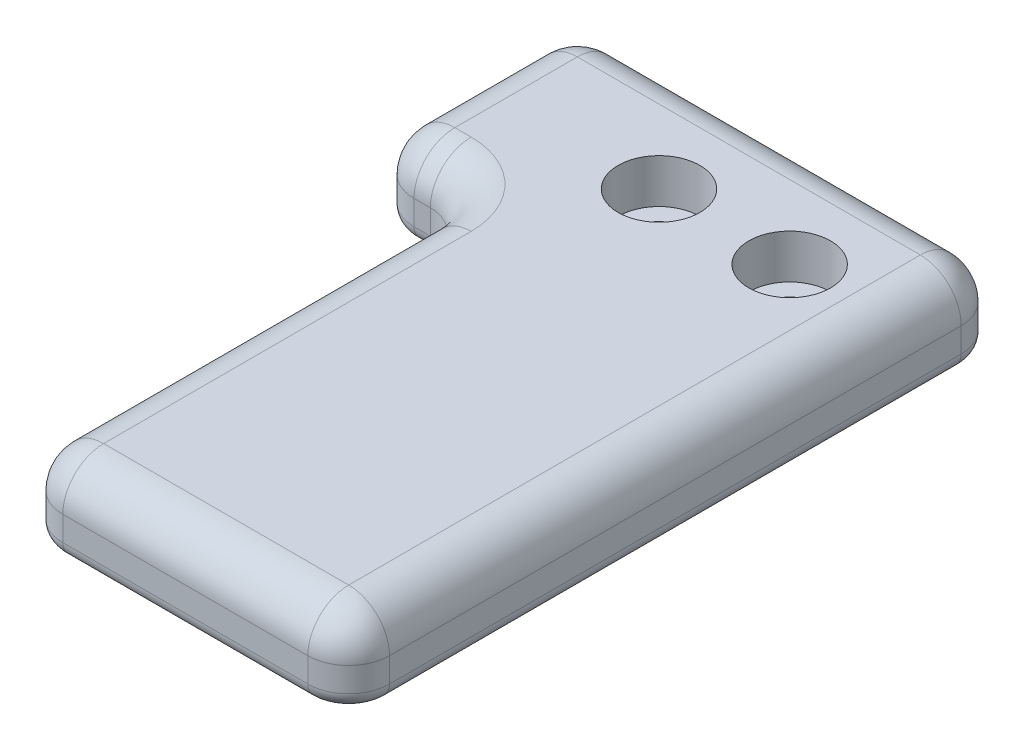
ISO-10303-21;
HEADER;
FILE_DESCRIPTION(('STEP AP214'),'2;1');
FILE_NAME('part.step','',(''),(''),'','','');
FILE_SCHEMA(('AUTOMOTIVE_DESIGN { 1 0 10303 214 1 1 1 1 }'));
ENDSEC;
DATA;
#1=APPLICATION_CONTEXT('core data for automotive mechanical design processes');
#2=APPLICATION_PROTOCOL_DEFINITION('international standard','automotive_design',2000,#1);
#3=PRODUCT_CONTEXT('',#1,'mechanical');
#4=PRODUCT('Part','Part','',(#3));
#5=PRODUCT_RELATED_PRODUCT_CATEGORY('part','',(#4));
#6=PRODUCT_DEFINITION_FORMATION('','',#4);
#7=PRODUCT_DEFINITION_CONTEXT('part definition',#1,'design');
#8=PRODUCT_DEFINITION('design','',#6,#7);
#9=PRODUCT_DEFINITION_SHAPE('','',#8);
#10=(LENGTH_UNIT() NAMED_UNIT(*) SI_UNIT(.MILLI.,.METRE.));
#11=(NAMED_UNIT(*) PLANE_ANGLE_UNIT() SI_UNIT($,.RADIAN.));
#12=(NAMED_UNIT(*) SI_UNIT($,.STERADIAN.) SOLID_ANGLE_UNIT());
#13=UNCERTAINTY_MEASURE_WITH_UNIT(LENGTH_MEASURE(1.E-05),#10,'distance_accuracy_value','');
#14=(GEOMETRIC_REPRESENTATION_CONTEXT(3) GLOBAL_UNCERTAINTY_ASSIGNED_CONTEXT((#13)) GLOBAL_UNIT_ASSIGNED_CONTEXT((#10,
#11,#12)) REPRESENTATION_CONTEXT('',''));
#15=CARTESIAN_POINT('',(0.,0.,0.));
#16=DIRECTION('',(0.,0.,1.));
#17=DIRECTION('',(1.,0.,0.));
#18=AXIS2_PLACEMENT_3D('',#15,#16,#17);
#19=CARTESIAN_POINT('',(15.7975674601214,10.,0.));
#20=DIRECTION('',(-1.,0.,0.));
#21=DIRECTION('',(0.,0.,1.));
#22=AXIS2_PLACEMENT_3D('',#19,#20,#21);
#23=PLANE('',#22);
#24=DIRECTION('',(0.,-1.,0.));
#25=VECTOR('',#24,1.);
#26=CARTESIAN_POINT('',(15.7975674601214,10.,-67.0000000000004));
#27=LINE('',#26,#25);
#28=CARTESIAN_POINT('',(15.7975674601214,5.,-67.0000000000004));
#29=VERTEX_POINT('',#28);
#30=CARTESIAN_POINT('',(15.7975674601214,2.,-67.0000000000004));
#31=VERTEX_POINT('',#30);
#32=EDGE_CURVE('E401',#29,#31,#27,.T.);
#33=ORIENTED_EDGE('',*,*,#32,.T.);
#34=DIRECTION('',(0.,0.,-1.));
#35=VECTOR('',#34,1.);
#36=CARTESIAN_POINT('',(15.7975674601214,2.,-52.0000000000003));
#37=LINE('',#36,#35);
#38=CARTESIAN_POINT('',(15.7975674601214,2.,-52.0000000000003));
#39=VERTEX_POINT('',#38);
#40=EDGE_CURVE('E326',#31,#39,#37,.F.);
#41=ORIENTED_EDGE('',*,*,#40,.T.);
#42=DIRECTION('',(0.,-1.,0.));
#43=VECTOR('',#42,1.);
#44=CARTESIAN_POINT('',(15.7975674601214,10.,-52.0000000000003));
#45=LINE('',#44,#43);
#46=CARTESIAN_POINT('',(15.7975674601214,5.,-52.0000000000003));
#47=VERTEX_POINT('',#46);
#48=EDGE_CURVE('E192',#39,#47,#45,.F.);
#49=ORIENTED_EDGE('',*,*,#48,.T.);
#50=DIRECTION('',(0.,0.,-1.));
#51=VECTOR('',#50,1.);
#52=CARTESIAN_POINT('',(15.7975674601214,5.,0.));
#53=LINE('',#52,#51);
#54=EDGE_CURVE('E229',#47,#29,#53,.T.);
#55=ORIENTED_EDGE('',*,*,#54,.T.);
#56=EDGE_LOOP('',(#33,#41,#49,#55));
#57=FACE_BOUND('',#56,.T.);
#58=ADVANCED_FACE('F39',(#57),#23,.T.);
#59=CARTESIAN_POINT('',(3.26128013483643E-13,10.,-47.0000000000005));
#60=DIRECTION('',(0.,0.,1.));
#61=DIRECTION('',(1.,0.,0.));
#62=AXIS2_PLACEMENT_3D('',#59,#60,#61);
#63=PLANE('',#62);
#64=DIRECTION('',(0.,-1.,0.));
#65=VECTOR('',#64,1.);
#66=CARTESIAN_POINT('',(20.7975674601214,10.,-47.0000000000003));
#67=LINE('',#66,#65);
#68=CARTESIAN_POINT('',(20.7975674601214,5.,-47.0000000000003));
#69=VERTEX_POINT('',#68);
#70=CARTESIAN_POINT('',(20.7975674601214,2.,-47.0000000000003));
#71=VERTEX_POINT('',#70);
#72=EDGE_CURVE('E223',#69,#71,#67,.T.);
#73=ORIENTED_EDGE('',*,*,#72,.T.);
#74=DIRECTION('',(-1.,0.,0.));
#75=VECTOR('',#74,1.);
#76=CARTESIAN_POINT('',(22.7975674601214,2.,-47.0000000000003));
#77=LINE('',#76,#75);
#78=CARTESIAN_POINT('',(22.7975674601214,2.,-47.0000000000003));
#79=VERTEX_POINT('',#78);
#80=EDGE_CURVE('E330',#71,#79,#77,.F.);
#81=ORIENTED_EDGE('',*,*,#80,.T.);
#82=DIRECTION('',(0.,-1.,0.));
#83=VECTOR('',#82,1.);
#84=CARTESIAN_POINT('',(22.7975674601214,10.,-47.0000000000003));
#85=LINE('',#84,#83);
#86=CARTESIAN_POINT('',(22.7975674601214,5.,-47.0000000000003));
#87=VERTEX_POINT('',#86);
#88=EDGE_CURVE('E218',#79,#87,#85,.F.);
#89=ORIENTED_EDGE('',*,*,#88,.T.);
#90=DIRECTION('',(-1.,0.,0.));
#91=VECTOR('',#90,1.);
#92=CARTESIAN_POINT('',(3.26128013483643E-13,5.,-47.0000000000005));
#93=LINE('',#92,#91);
#94=EDGE_CURVE('E249',#87,#69,#93,.T.);
#95=ORIENTED_EDGE('',*,*,#94,.T.);
#96=EDGE_LOOP('',(#73,#81,#89,#95));
#97=FACE_BOUND('',#96,.T.);
#98=ADVANCED_FACE('F387',(#97),#63,.T.);
#99=CARTESIAN_POINT('',(27.7975674601214,10.,0.));
#100=DIRECTION('',(-1.,0.,0.));
#101=DIRECTION('',(0.,0.,1.));
#102=AXIS2_PLACEMENT_3D('',#99,#100,#101);
#103=PLANE('',#102);
#104=DIRECTION('',(0.,-1.,0.));
#105=VECTOR('',#104,1.);
#106=CARTESIAN_POINT('',(27.7975674601214,0.,-42.0000000000003));
#107=LINE('',#106,#105);
#108=CARTESIAN_POINT('',(27.7975674601214,5.,-42.0000000000003));
#109=VERTEX_POINT('',#108);
#110=CARTESIAN_POINT('',(27.7975674601214,2.,-42.0000000000003));
#111=VERTEX_POINT('',#110);
#112=EDGE_CURVE('E193',#109,#111,#107,.T.);
#113=ORIENTED_EDGE('',*,*,#112,.T.);
#114=DIRECTION('',(0.,0.,-1.));
#115=VECTOR('',#114,1.);
#116=CARTESIAN_POINT('',(27.7975674601214,2.,2.99999999999973));
#117=LINE('',#116,#115);
#118=CARTESIAN_POINT('',(27.7975674601214,2.,2.99999999999973));
#119=VERTEX_POINT('',#118);
#120=EDGE_CURVE('E63',#111,#119,#117,.F.);
#121=ORIENTED_EDGE('',*,*,#120,.T.);
#122=DIRECTION('',(0.,-1.,0.));
#123=VECTOR('',#122,1.);
#124=CARTESIAN_POINT('',(27.7975674601214,10.,2.99999999999973));
#125=LINE('',#124,#123);
#126=CARTESIAN_POINT('',(27.7975674601214,5.,2.99999999999973));
#127=VERTEX_POINT('',#126);
#128=EDGE_CURVE('E184',#119,#127,#125,.F.);
#129=ORIENTED_EDGE('',*,*,#128,.T.);
#130=DIRECTION('',(0.,0.,-1.));
#131=VECTOR('',#130,1.);
#132=CARTESIAN_POINT('',(27.7975674601214,5.,0.));
#133=LINE('',#132,#131);
#134=EDGE_CURVE('E188',#127,#109,#133,.T.);
#135=ORIENTED_EDGE('',*,*,#134,.T.);
#136=EDGE_LOOP('',(#113,#121,#129,#135));
#137=FACE_BOUND('',#136,.T.);
#138=ADVANCED_FACE('F186',(#137),#103,.T.);
#139=CARTESIAN_POINT('',(0.,10.,7.99999999999973));
#140=DIRECTION('',(0.,0.,-1.));
#141=DIRECTION('',(-1.,0.,0.));
#142=AXIS2_PLACEMENT_3D('',#139,#140,#141);
#143=PLANE('',#142);
#144=DIRECTION('',(0.,-1.,0.));
#145=VECTOR('',#144,1.);
#146=CARTESIAN_POINT('',(32.7975674601214,0.,7.99999999999973));
#147=LINE('',#146,#145);
#148=CARTESIAN_POINT('',(32.7975674601214,5.,7.99999999999973));
#149=VERTEX_POINT('',#148);
#150=CARTESIAN_POINT('',(32.7975674601214,2.,7.99999999999973));
#151=VERTEX_POINT('',#150);
#152=EDGE_CURVE('E216',#149,#151,#147,.T.);
#153=ORIENTED_EDGE('',*,*,#152,.T.);
#154=DIRECTION('',(1.,0.,0.));
#155=VECTOR('',#154,1.);
#156=CARTESIAN_POINT('',(0.,2.,7.99999999999973));
#157=LINE('',#156,#155);
#158=CARTESIAN_POINT('',(62.7975674601214,2.,7.99999999999973));
#159=VERTEX_POINT('',#158);
#160=EDGE_CURVE('E11',#151,#159,#157,.T.);
#161=ORIENTED_EDGE('',*,*,#160,.T.);
#162=DIRECTION('',(0.,-1.,0.));
#163=VECTOR('',#162,1.);
#164=CARTESIAN_POINT('',(62.7975674601214,10.,7.99999999999973));
#165=LINE('',#164,#163);
#166=CARTESIAN_POINT('',(62.7975674601214,5.,7.99999999999973));
#167=VERTEX_POINT('',#166);
#168=EDGE_CURVE('E290',#159,#167,#165,.F.);
#169=ORIENTED_EDGE('',*,*,#168,.T.);
#170=DIRECTION('',(1.,0.,0.));
#171=VECTOR('',#170,1.);
#172=CARTESIAN_POINT('',(32.7975674601214,5.,7.99999999999973));
#173=LINE('',#172,#171);
#174=EDGE_CURVE('E213',#167,#149,#173,.F.);
#175=ORIENTED_EDGE('',*,*,#174,.T.);
#176=EDGE_LOOP('',(#153,#161,#169,#175));
#177=FACE_BOUND('',#176,.T.);
#178=ADVANCED_FACE('F491',(#177),#143,.F.);
#179=CARTESIAN_POINT('',(67.7975674601214,10.,0.));
#180=DIRECTION('',(-1.,0.,0.));
#181=DIRECTION('',(0.,0.,1.));
#182=AXIS2_PLACEMENT_3D('',#179,#180,#181);
#183=PLANE('',#182);
#184=DIRECTION('',(0.,-1.,0.));
#185=VECTOR('',#184,1.);
#186=CARTESIAN_POINT('',(67.7975674601214,10.,2.99999999999973));
#187=LINE('',#186,#185);
#188=CARTESIAN_POINT('',(67.7975674601214,5.,2.99999999999973));
#189=VERTEX_POINT('',#188);
#190=CARTESIAN_POINT('',(67.7975674601214,2.,2.99999999999973));
#191=VERTEX_POINT('',#190);
#192=EDGE_CURVE('E391',#189,#191,#187,.T.);
#193=ORIENTED_EDGE('',*,*,#192,.T.);
#194=DIRECTION('',(0.,0.,-1.));
#195=VECTOR('',#194,1.);
#196=CARTESIAN_POINT('',(67.7975674601214,2.,0.));
#197=LINE('',#196,#195);
#198=CARTESIAN_POINT('',(67.7975674601214,2.,-67.0000000000003));
#199=VERTEX_POINT('',#198);
#200=EDGE_CURVE('E318',#191,#199,#197,.T.);
#201=ORIENTED_EDGE('',*,*,#200,.T.);
#202=DIRECTION('',(0.,-1.,0.));
#203=VECTOR('',#202,1.);
#204=CARTESIAN_POINT('',(67.7975674601214,10.,-67.0000000000003));
#205=LINE('',#204,#203);
#206=CARTESIAN_POINT('',(67.7975674601214,5.,-67.0000000000003));
#207=VERTEX_POINT('',#206);
#208=EDGE_CURVE('E390',#199,#207,#205,.F.);
#209=ORIENTED_EDGE('',*,*,#208,.T.);
#210=DIRECTION('',(0.,0.,-1.));
#211=VECTOR('',#210,1.);
#212=CARTESIAN_POINT('',(67.7975674601214,5.,2.99999999999973));
#213=LINE('',#212,#211);
#214=EDGE_CURVE('E256',#207,#189,#213,.F.);
#215=ORIENTED_EDGE('',*,*,#214,.T.);
#216=EDGE_LOOP('',(#193,#201,#209,#215));
#217=FACE_BOUND('',#216,.T.);
#218=ADVANCED_FACE('F509',(#217),#183,.F.);
#219=CARTESIAN_POINT('',(1.15292391018767E-13,10.,-72.0000000000004));
#220=DIRECTION('',(0.,0.,-1.));
#221=DIRECTION('',(-1.,0.,0.));
#222=AXIS2_PLACEMENT_3D('',#219,#220,#221);
#223=PLANE('',#222);
#224=DIRECTION('',(0.,-1.,0.));
#225=VECTOR('',#224,1.);
#226=CARTESIAN_POINT('',(62.7975674601214,0.,-72.0000000000003));
#227=LINE('',#226,#225);
#228=CARTESIAN_POINT('',(62.7975674601214,5.,-72.0000000000003));
#229=VERTEX_POINT('',#228);
#230=CARTESIAN_POINT('',(62.7975674601214,2.,-72.0000000000003));
#231=VERTEX_POINT('',#230);
#232=EDGE_CURVE('E398',#229,#231,#227,.T.);
#233=ORIENTED_EDGE('',*,*,#232,.T.);
#234=DIRECTION('',(1.,0.,0.));
#235=VECTOR('',#234,1.);
#236=CARTESIAN_POINT('',(20.7975674601214,2.,-72.0000000000004));
#237=LINE('',#236,#235);
#238=CARTESIAN_POINT('',(20.7975674601214,2.,-72.0000000000004));
#239=VERTEX_POINT('',#238);
#240=EDGE_CURVE('E322',#231,#239,#237,.F.);
#241=ORIENTED_EDGE('',*,*,#240,.T.);
#242=DIRECTION('',(0.,-1.,0.));
#243=VECTOR('',#242,1.);
#244=CARTESIAN_POINT('',(20.7975674601214,10.,-72.0000000000004));
#245=LINE('',#244,#243);
#246=CARTESIAN_POINT('',(20.7975674601214,5.,-72.0000000000004));
#247=VERTEX_POINT('',#246);
#248=EDGE_CURVE('E396',#239,#247,#245,.F.);
#249=ORIENTED_EDGE('',*,*,#248,.T.);
#250=DIRECTION('',(1.,0.,0.));
#251=VECTOR('',#250,1.);
#252=CARTESIAN_POINT('',(1.15292391018767E-13,5.,-72.0000000000004));
#253=LINE('',#252,#251);
#254=EDGE_CURVE('E254',#247,#229,#253,.T.);
#255=ORIENTED_EDGE('',*,*,#254,.T.);
#256=EDGE_LOOP('',(#233,#241,#249,#255));
#257=FACE_BOUND('',#256,.T.);
#258=ADVANCED_FACE('F438',(#257),#223,.T.);
#259=CARTESIAN_POINT('',(0.,10.,0.));
#260=DIRECTION('',(0.,1.,0.));
#261=DIRECTION('',(0.,0.,1.));
#262=AXIS2_PLACEMENT_3D('',#259,#260,#261);
#263=PLANE('',#262);
#264=CARTESIAN_POINT('',(55.7975674601214,10.,-58.0000000000002));
#265=DIRECTION('',(0.,1.,0.));
#266=DIRECTION('',(0.,0.,1.));
#267=AXIS2_PLACEMENT_3D('',#264,#265,#266);
#268=CIRCLE('',#267,5.);
#269=CARTESIAN_POINT('',(55.7975674601214,10.,-53.0000000000002));
#270=VERTEX_POINT('',#269);
#271=EDGE_CURVE('E428',#270,#270,#268,.T.);
#272=ORIENTED_EDGE('',*,*,#271,.F.);
#273=EDGE_LOOP('',(#272));
#274=FACE_BOUND('',#273,.T.);
#275=CARTESIAN_POINT('',(39.7975674601214,10.,-58.0000000000003));
#276=DIRECTION('',(0.,1.,0.));
#277=DIRECTION('',(0.,0.,1.));
#278=AXIS2_PLACEMENT_3D('',#275,#276,#277);
#279=CIRCLE('',#278,5.);
#280=CARTESIAN_POINT('',(39.7975674601214,10.,-53.0000000000003));
#281=VERTEX_POINT('',#280);
#282=EDGE_CURVE('E416',#281,#281,#279,.T.);
#283=ORIENTED_EDGE('',*,*,#282,.F.);
#284=EDGE_LOOP('',(#283));
#285=FACE_BOUND('',#284,.T.);
#286=DIRECTION('',(1.,0.,0.));
#287=VECTOR('',#286,1.);
#288=CARTESIAN_POINT('',(1.07285974975797E-13,10.,-67.0000000000004));
#289=LINE('',#288,#287);
#290=CARTESIAN_POINT('',(62.7975674601214,10.,-67.0000000000003));
#291=VERTEX_POINT('',#290);
#292=CARTESIAN_POINT('',(20.7975674601214,10.,-67.0000000000004));
#293=VERTEX_POINT('',#292);
#294=EDGE_CURVE('E237',#291,#293,#289,.F.);
#295=ORIENTED_EDGE('',*,*,#294,.T.);
#296=DIRECTION('',(0.,0.,-1.));
#297=VECTOR('',#296,1.);
#298=CARTESIAN_POINT('',(20.7975674601214,10.,0.));
#299=LINE('',#298,#297);
#300=CARTESIAN_POINT('',(20.7975674601214,10.,-52.0000000000003));
#301=VERTEX_POINT('',#300);
#302=EDGE_CURVE('E243',#293,#301,#299,.F.);
#303=ORIENTED_EDGE('',*,*,#302,.T.);
#304=DIRECTION('',(-1.,0.,0.));
#305=VECTOR('',#304,1.);
#306=CARTESIAN_POINT('',(3.60822483003179E-13,10.,-52.0000000000005));
#307=LINE('',#306,#305);
#308=CARTESIAN_POINT('',(22.7975674601215,10.,-52.0000000000003));
#309=VERTEX_POINT('',#308);
#310=EDGE_CURVE('E241',#301,#309,#307,.F.);
#311=ORIENTED_EDGE('',*,*,#310,.T.);
#312=CARTESIAN_POINT('',(22.7975674601214,10.,-42.0000000000003));
#313=DIRECTION('',(0.,1.,0.));
#314=DIRECTION('',(0.,0.,1.));
#315=AXIS2_PLACEMENT_3D('',#312,#313,#314);
#316=CIRCLE('',#315,10.);
#317=CARTESIAN_POINT('',(32.7975674601214,10.,-42.0000000000003));
#318=VERTEX_POINT('',#317);
#319=EDGE_CURVE('E239',#309,#318,#316,.F.);
#320=ORIENTED_EDGE('',*,*,#319,.T.);
#321=DIRECTION('',(0.,0.,-1.));
#322=VECTOR('',#321,1.);
#323=CARTESIAN_POINT('',(32.7975674601214,10.,0.));
#324=LINE('',#323,#322);
#325=CARTESIAN_POINT('',(32.7975674601214,10.,2.99999999999973));
#326=VERTEX_POINT('',#325);
#327=EDGE_CURVE('E231',#318,#326,#324,.F.);
#328=ORIENTED_EDGE('',*,*,#327,.T.);
#329=DIRECTION('',(1.,0.,0.));
#330=VECTOR('',#329,1.);
#331=CARTESIAN_POINT('',(62.7975674601214,10.,2.99999999999973));
#332=LINE('',#331,#330);
#333=CARTESIAN_POINT('',(62.7975674601214,10.,2.99999999999973));
#334=VERTEX_POINT('',#333);
#335=EDGE_CURVE('E233',#326,#334,#332,.T.);
#336=ORIENTED_EDGE('',*,*,#335,.T.);
#337=DIRECTION('',(0.,0.,-1.));
#338=VECTOR('',#337,1.);
#339=CARTESIAN_POINT('',(62.7975674601214,10.,-67.0000000000003));
#340=LINE('',#339,#338);
#341=EDGE_CURVE('E235',#334,#291,#340,.T.);
#342=ORIENTED_EDGE('',*,*,#341,.T.);
#343=EDGE_LOOP('',(#295,#303,#311,#320,#328,#336,#342));
#344=FACE_BOUND('',#343,.T.);
#345=ADVANCED_FACE('F434',(#274,#285,#344),#263,.T.);
#346=CARTESIAN_POINT('',(0.,0.,0.));
#347=DIRECTION('',(0.,1.,0.));
#348=DIRECTION('',(0.,0.,1.));
#349=AXIS2_PLACEMENT_3D('',#346,#347,#348);
#350=PLANE('',#349);
#351=CARTESIAN_POINT('',(55.7975674601214,0.,-58.0000000000002));
#352=DIRECTION('',(0.,1.,0.));
#353=DIRECTION('',(0.,0.,1.));
#354=AXIS2_PLACEMENT_3D('',#351,#352,#353);
#355=CIRCLE('',#354,2.75);
#356=CARTESIAN_POINT('',(55.7975674601214,0.,-55.2500000000002));
#357=VERTEX_POINT('',#356);
#358=EDGE_CURVE('E419',#357,#357,#355,.T.);
#359=ORIENTED_EDGE('',*,*,#358,.T.);
#360=EDGE_LOOP('',(#359));
#361=FACE_BOUND('',#360,.T.);
#362=CARTESIAN_POINT('',(39.7975674601214,0.,-58.0000000000003));
#363=DIRECTION('',(0.,1.,0.));
#364=DIRECTION('',(0.,0.,1.));
#365=AXIS2_PLACEMENT_3D('',#362,#363,#364);
#366=CIRCLE('',#365,2.75);
#367=CARTESIAN_POINT('',(39.7975674601214,0.,-55.2500000000003));
#368=VERTEX_POINT('',#367);
#369=EDGE_CURVE('E339',#368,#368,#366,.T.);
#370=ORIENTED_EDGE('',*,*,#369,.T.);
#371=EDGE_LOOP('',(#370));
#372=FACE_BOUND('',#371,.T.);
#373=DIRECTION('',(0.,0.,-1.));
#374=VECTOR('',#373,1.);
#375=CARTESIAN_POINT('',(65.7975674601214,0.,0.));
#376=LINE('',#375,#374);
#377=CARTESIAN_POINT('',(65.7975674601214,0.,-67.0000000000003));
#378=VERTEX_POINT('',#377);
#379=CARTESIAN_POINT('',(65.7975674601214,0.,2.99999999999973));
#380=VERTEX_POINT('',#379);
#381=EDGE_CURVE('E310',#378,#380,#376,.F.);
#382=ORIENTED_EDGE('',*,*,#381,.T.);
#383=CARTESIAN_POINT('',(62.7975674601214,0.,2.99999999999973));
#384=DIRECTION('',(0.,1.,0.));
#385=DIRECTION('',(0.,0.,1.));
#386=AXIS2_PLACEMENT_3D('',#383,#384,#385);
#387=CIRCLE('',#386,3.);
#388=CARTESIAN_POINT('',(62.7975674601214,0.,5.99999999999973));
#389=VERTEX_POINT('',#388);
#390=EDGE_CURVE('E312',#380,#389,#387,.F.);
#391=ORIENTED_EDGE('',*,*,#390,.T.);
#392=DIRECTION('',(1.,0.,0.));
#393=VECTOR('',#392,1.);
#394=CARTESIAN_POINT('',(0.,0.,5.99999999999973));
#395=LINE('',#394,#393);
#396=CARTESIAN_POINT('',(32.7975674601214,0.,5.99999999999973));
#397=VERTEX_POINT('',#396);
#398=EDGE_CURVE('E212',#389,#397,#395,.F.);
#399=ORIENTED_EDGE('',*,*,#398,.T.);
#400=CARTESIAN_POINT('',(32.7975674601214,0.,2.99999999999973));
#401=DIRECTION('',(0.,1.,0.));
#402=DIRECTION('',(0.,0.,1.));
#403=AXIS2_PLACEMENT_3D('',#400,#401,#402);
#404=CIRCLE('',#403,3.);
#405=CARTESIAN_POINT('',(29.7975674601214,0.,2.99999999999973));
#406=VERTEX_POINT('',#405);
#407=EDGE_CURVE('E292',#397,#406,#404,.F.);
#408=ORIENTED_EDGE('',*,*,#407,.T.);
#409=DIRECTION('',(0.,0.,-1.));
#410=VECTOR('',#409,1.);
#411=CARTESIAN_POINT('',(29.7975674601214,0.,-42.0000000000003));
#412=LINE('',#411,#410);
#413=CARTESIAN_POINT('',(29.7975674601214,0.,-42.0000000000003));
#414=VERTEX_POINT('',#413);
#415=EDGE_CURVE('E294',#406,#414,#412,.T.);
#416=ORIENTED_EDGE('',*,*,#415,.T.);
#417=CARTESIAN_POINT('',(22.7975674601214,0.,-42.0000000000003));
#418=DIRECTION('',(0.,1.,0.));
#419=DIRECTION('',(0.,0.,1.));
#420=AXIS2_PLACEMENT_3D('',#417,#418,#419);
#421=CIRCLE('',#420,7.);
#422=CARTESIAN_POINT('',(22.7975674601214,0.,-49.0000000000003));
#423=VERTEX_POINT('',#422);
#424=EDGE_CURVE('E296',#414,#423,#421,.T.);
#425=ORIENTED_EDGE('',*,*,#424,.T.);
#426=DIRECTION('',(-1.,0.,0.));
#427=VECTOR('',#426,1.);
#428=CARTESIAN_POINT('',(20.7975674601214,0.,-49.0000000000003));
#429=LINE('',#428,#427);
#430=CARTESIAN_POINT('',(20.7975674601214,0.,-49.0000000000003));
#431=VERTEX_POINT('',#430);
#432=EDGE_CURVE('E298',#423,#431,#429,.T.);
#433=ORIENTED_EDGE('',*,*,#432,.T.);
#434=CARTESIAN_POINT('',(20.7975674601214,0.,-52.0000000000003));
#435=DIRECTION('',(0.,1.,0.));
#436=DIRECTION('',(0.,0.,1.));
#437=AXIS2_PLACEMENT_3D('',#434,#435,#436);
#438=CIRCLE('',#437,3.);
#439=CARTESIAN_POINT('',(17.7975674601214,0.,-52.0000000000003));
#440=VERTEX_POINT('',#439);
#441=EDGE_CURVE('E300',#431,#440,#438,.F.);
#442=ORIENTED_EDGE('',*,*,#441,.T.);
#443=DIRECTION('',(0.,0.,-1.));
#444=VECTOR('',#443,1.);
#445=CARTESIAN_POINT('',(17.7975674601214,0.,-67.0000000000004));
#446=LINE('',#445,#444);
#447=CARTESIAN_POINT('',(17.7975674601214,0.,-67.0000000000004));
#448=VERTEX_POINT('',#447);
#449=EDGE_CURVE('E302',#440,#448,#446,.T.);
#450=ORIENTED_EDGE('',*,*,#449,.T.);
#451=CARTESIAN_POINT('',(20.7975674601214,0.,-67.0000000000004));
#452=DIRECTION('',(0.,1.,0.));
#453=DIRECTION('',(0.,0.,1.));
#454=AXIS2_PLACEMENT_3D('',#451,#452,#453);
#455=CIRCLE('',#454,3.);
#456=CARTESIAN_POINT('',(20.7975674601214,0.,-70.0000000000004));
#457=VERTEX_POINT('',#456);
#458=EDGE_CURVE('E304',#448,#457,#455,.F.);
#459=ORIENTED_EDGE('',*,*,#458,.T.);
#460=DIRECTION('',(1.,0.,0.));
#461=VECTOR('',#460,1.);
#462=CARTESIAN_POINT('',(62.7975674601214,0.,-70.0000000000003));
#463=LINE('',#462,#461);
#464=CARTESIAN_POINT('',(62.7975674601214,0.,-70.0000000000003));
#465=VERTEX_POINT('',#464);
#466=EDGE_CURVE('E306',#457,#465,#463,.T.);
#467=ORIENTED_EDGE('',*,*,#466,.T.);
#468=CARTESIAN_POINT('',(62.7975674601214,0.,-67.0000000000003));
#469=DIRECTION('',(0.,1.,0.));
#470=DIRECTION('',(0.,0.,1.));
#471=AXIS2_PLACEMENT_3D('',#468,#469,#470);
#472=CIRCLE('',#471,3.);
#473=EDGE_CURVE('E308',#465,#378,#472,.F.);
#474=ORIENTED_EDGE('',*,*,#473,.T.);
#475=EDGE_LOOP('',(#382,#391,#399,#408,#416,#425,#433,#442,#450,#459,#467,#474));
#476=FACE_BOUND('',#475,.T.);
#477=ADVANCED_FACE('F437',(#361,#372,#476),#350,.F.);
#478=CARTESIAN_POINT('',(32.7975674601214,10.,2.99999999999973));
#479=DIRECTION('',(0.,1.,0.));
#480=DIRECTION('',(0.,0.,1.));
#481=AXIS2_PLACEMENT_3D('',#478,#479,#480);
#482=CYLINDRICAL_SURFACE('',#481,5.);
#483=ORIENTED_EDGE('',*,*,#128,.F.);
#484=CARTESIAN_POINT('',(32.7975674601214,2.,2.99999999999973));
#485=DIRECTION('',(0.,1.,0.));
#486=DIRECTION('',(0.,0.,1.));
#487=AXIS2_PLACEMENT_3D('',#484,#485,#486);
#488=CIRCLE('',#487,5.);
#489=EDGE_CURVE('E48',#119,#151,#488,.T.);
#490=ORIENTED_EDGE('',*,*,#489,.T.);
#491=ORIENTED_EDGE('',*,*,#152,.F.);
#492=CARTESIAN_POINT('',(32.7975674601214,5.,2.99999999999973));
#493=DIRECTION('',(0.,1.,0.));
#494=DIRECTION('',(0.,0.,1.));
#495=AXIS2_PLACEMENT_3D('',#492,#493,#494);
#496=CIRCLE('',#495,5.);
#497=EDGE_CURVE('E201',#149,#127,#496,.F.);
#498=ORIENTED_EDGE('',*,*,#497,.T.);
#499=EDGE_LOOP('',(#483,#490,#491,#498));
#500=FACE_BOUND('',#499,.T.);
#501=ADVANCED_FACE('F215',(#500),#482,.T.);
#502=CARTESIAN_POINT('',(20.7975674601214,10.,-67.0000000000004));
#503=DIRECTION('',(0.,-1.,0.));
#504=DIRECTION('',(0.,0.,-1.));
#505=AXIS2_PLACEMENT_3D('',#502,#503,#504);
#506=CYLINDRICAL_SURFACE('',#505,5.);
#507=ORIENTED_EDGE('',*,*,#248,.F.);
#508=CARTESIAN_POINT('',(20.7975674601214,2.,-67.0000000000004));
#509=DIRECTION('',(0.,1.,0.));
#510=DIRECTION('',(0.,0.,1.));
#511=AXIS2_PLACEMENT_3D('',#508,#509,#510);
#512=CIRCLE('',#511,5.);
#513=EDGE_CURVE('E324',#239,#31,#512,.T.);
#514=ORIENTED_EDGE('',*,*,#513,.T.);
#515=ORIENTED_EDGE('',*,*,#32,.F.);
#516=CARTESIAN_POINT('',(20.7975674601214,5.,-67.0000000000004));
#517=DIRECTION('',(0.,-1.,0.));
#518=DIRECTION('',(0.,0.,-1.));
#519=AXIS2_PLACEMENT_3D('',#516,#517,#518);
#520=CIRCLE('',#519,5.);
#521=EDGE_CURVE('E221',#29,#247,#520,.T.);
#522=ORIENTED_EDGE('',*,*,#521,.T.);
#523=EDGE_LOOP('',(#507,#514,#515,#522));
#524=FACE_BOUND('',#523,.T.);
#525=ADVANCED_FACE('F529',(#524),#506,.T.);
#526=CARTESIAN_POINT('',(62.7975674601214,10.,-67.0000000000003));
#527=DIRECTION('',(0.,1.,0.));
#528=DIRECTION('',(0.,0.,1.));
#529=AXIS2_PLACEMENT_3D('',#526,#527,#528);
#530=CYLINDRICAL_SURFACE('',#529,5.);
#531=ORIENTED_EDGE('',*,*,#208,.F.);
#532=CARTESIAN_POINT('',(62.7975674601214,2.,-67.0000000000003));
#533=DIRECTION('',(0.,1.,0.));
#534=DIRECTION('',(0.,0.,1.));
#535=AXIS2_PLACEMENT_3D('',#532,#533,#534);
#536=CIRCLE('',#535,5.);
#537=EDGE_CURVE('E320',#199,#231,#536,.T.);
#538=ORIENTED_EDGE('',*,*,#537,.T.);
#539=ORIENTED_EDGE('',*,*,#232,.F.);
#540=CARTESIAN_POINT('',(62.7975674601214,5.,-67.0000000000003));
#541=DIRECTION('',(0.,1.,0.));
#542=DIRECTION('',(0.,0.,1.));
#543=AXIS2_PLACEMENT_3D('',#540,#541,#542);
#544=CIRCLE('',#543,5.);
#545=EDGE_CURVE('E217',#229,#207,#544,.F.);
#546=ORIENTED_EDGE('',*,*,#545,.T.);
#547=EDGE_LOOP('',(#531,#538,#539,#546));
#548=FACE_BOUND('',#547,.T.);
#549=ADVANCED_FACE('F512',(#548),#530,.T.);
#550=CARTESIAN_POINT('',(22.7975674601214,10.,-42.0000000000003));
#551=DIRECTION('',(0.,1.,0.));
#552=DIRECTION('',(0.,0.,1.));
#553=AXIS2_PLACEMENT_3D('',#550,#551,#552);
#554=CYLINDRICAL_SURFACE('',#553,5.);
#555=ORIENTED_EDGE('',*,*,#88,.F.);
#556=CARTESIAN_POINT('',(22.7975674601214,2.,-42.0000000000003));
#557=DIRECTION('',(0.,1.,0.));
#558=DIRECTION('',(0.,0.,1.));
#559=AXIS2_PLACEMENT_3D('',#556,#557,#558);
#560=CIRCLE('',#559,5.);
#561=EDGE_CURVE('E332',#79,#111,#560,.F.);
#562=ORIENTED_EDGE('',*,*,#561,.T.);
#563=ORIENTED_EDGE('',*,*,#112,.F.);
#564=CARTESIAN_POINT('',(22.7975674601214,5.,-42.0000000000003));
#565=DIRECTION('',(0.,1.,0.));
#566=DIRECTION('',(0.,0.,1.));
#567=AXIS2_PLACEMENT_3D('',#564,#565,#566);
#568=CIRCLE('',#567,5.);
#569=EDGE_CURVE('E251',#109,#87,#568,.T.);
#570=ORIENTED_EDGE('',*,*,#569,.T.);
#571=EDGE_LOOP('',(#555,#562,#563,#570));
#572=FACE_BOUND('',#571,.T.);
#573=ADVANCED_FACE('F470',(#572),#554,.F.);
#574=CARTESIAN_POINT('',(62.7975674601214,10.,2.99999999999973));
#575=DIRECTION('',(0.,-1.,0.));
#576=DIRECTION('',(0.,0.,-1.));
#577=AXIS2_PLACEMENT_3D('',#574,#575,#576);
#578=CYLINDRICAL_SURFACE('',#577,5.);
#579=ORIENTED_EDGE('',*,*,#168,.F.);
#580=CARTESIAN_POINT('',(62.7975674601214,2.,2.99999999999973));
#581=DIRECTION('',(0.,1.,0.));
#582=DIRECTION('',(0.,0.,1.));
#583=AXIS2_PLACEMENT_3D('',#580,#581,#582);
#584=CIRCLE('',#583,5.);
#585=EDGE_CURVE('E315',#159,#191,#584,.T.);
#586=ORIENTED_EDGE('',*,*,#585,.T.);
#587=ORIENTED_EDGE('',*,*,#192,.F.);
#588=CARTESIAN_POINT('',(62.7975674601214,5.,2.99999999999973));
#589=DIRECTION('',(0.,-1.,0.));
#590=DIRECTION('',(0.,0.,-1.));
#591=AXIS2_PLACEMENT_3D('',#588,#589,#590);
#592=CIRCLE('',#591,5.);
#593=EDGE_CURVE('E258',#189,#167,#592,.T.);
#594=ORIENTED_EDGE('',*,*,#593,.T.);
#595=EDGE_LOOP('',(#579,#586,#587,#594));
#596=FACE_BOUND('',#595,.T.);
#597=ADVANCED_FACE('F494',(#596),#578,.T.);
#598=CARTESIAN_POINT('',(20.7975674601214,10.,-52.0000000000003));
#599=DIRECTION('',(0.,-1.,0.));
#600=DIRECTION('',(0.,0.,-1.));
#601=AXIS2_PLACEMENT_3D('',#598,#599,#600);
#602=CYLINDRICAL_SURFACE('',#601,5.);
#603=ORIENTED_EDGE('',*,*,#48,.F.);
#604=CARTESIAN_POINT('',(20.7975674601214,2.,-52.0000000000003));
#605=DIRECTION('',(0.,1.,0.));
#606=DIRECTION('',(0.,0.,1.));
#607=AXIS2_PLACEMENT_3D('',#604,#605,#606);
#608=CIRCLE('',#607,5.);
#609=EDGE_CURVE('E328',#39,#71,#608,.T.);
#610=ORIENTED_EDGE('',*,*,#609,.T.);
#611=ORIENTED_EDGE('',*,*,#72,.F.);
#612=CARTESIAN_POINT('',(20.7975674601214,5.,-52.0000000000003));
#613=DIRECTION('',(0.,-1.,0.));
#614=DIRECTION('',(0.,0.,-1.));
#615=AXIS2_PLACEMENT_3D('',#612,#613,#614);
#616=CIRCLE('',#615,5.);
#617=EDGE_CURVE('E246',#69,#47,#616,.T.);
#618=ORIENTED_EDGE('',*,*,#617,.T.);
#619=EDGE_LOOP('',(#603,#610,#611,#618));
#620=FACE_BOUND('',#619,.T.);
#621=ADVANCED_FACE('F384',(#620),#602,.T.);
#622=CARTESIAN_POINT('',(20.7975674601214,5.,-67.0000000000004));
#623=DIRECTION('',(0.,0.,1.));
#624=DIRECTION('',(1.,0.,0.));
#625=AXIS2_PLACEMENT_3D('',#622,#623,#624);
#626=SPHERICAL_SURFACE('',#625,5.);
#627=CARTESIAN_POINT('',(20.7975674601214,5.,-67.0000000000004));
#628=DIRECTION('',(1.,0.,0.));
#629=DIRECTION('',(0.,0.,-1.));
#630=AXIS2_PLACEMENT_3D('',#627,#628,#629);
#631=CIRCLE('',#630,5.);
#632=EDGE_CURVE('E284',#247,#293,#631,.T.);
#633=ORIENTED_EDGE('',*,*,#632,.F.);
#634=ORIENTED_EDGE('',*,*,#521,.F.);
#635=CARTESIAN_POINT('',(20.7975674601214,5.,-67.0000000000004));
#636=DIRECTION('',(0.,0.,1.));
#637=DIRECTION('',(1.,0.,0.));
#638=AXIS2_PLACEMENT_3D('',#635,#636,#637);
#639=CIRCLE('',#638,5.);
#640=EDGE_CURVE('E287',#293,#29,#639,.T.);
#641=ORIENTED_EDGE('',*,*,#640,.F.);
#642=EDGE_LOOP('',(#633,#634,#641));
#643=FACE_BOUND('',#642,.T.);
#644=ADVANCED_FACE('F453',(#643),#626,.T.);
#645=CARTESIAN_POINT('',(20.7975674601214,5.,0.));
#646=DIRECTION('',(0.,0.,-1.));
#647=DIRECTION('',(-1.,0.,0.));
#648=AXIS2_PLACEMENT_3D('',#645,#646,#647);
#649=CYLINDRICAL_SURFACE('',#648,5.);
#650=ORIENTED_EDGE('',*,*,#640,.T.);
#651=ORIENTED_EDGE('',*,*,#54,.F.);
#652=CARTESIAN_POINT('',(20.7975674601214,5.,-52.0000000000003));
#653=DIRECTION('',(0.,0.,1.));
#654=DIRECTION('',(1.,0.,0.));
#655=AXIS2_PLACEMENT_3D('',#652,#653,#654);
#656=CIRCLE('',#655,5.);
#657=EDGE_CURVE('E281',#301,#47,#656,.T.);
#658=ORIENTED_EDGE('',*,*,#657,.F.);
#659=ORIENTED_EDGE('',*,*,#302,.F.);
#660=EDGE_LOOP('',(#650,#651,#658,#659));
#661=FACE_BOUND('',#660,.T.);
#662=ADVANCED_FACE('F457',(#661),#649,.T.);
#663=CARTESIAN_POINT('',(1.07285974975797E-13,5.,-67.0000000000004));
#664=DIRECTION('',(1.,0.,0.));
#665=DIRECTION('',(0.,0.,-1.));
#666=AXIS2_PLACEMENT_3D('',#663,#664,#665);
#667=CYLINDRICAL_SURFACE('',#666,5.);
#668=ORIENTED_EDGE('',*,*,#632,.T.);
#669=ORIENTED_EDGE('',*,*,#294,.F.);
#670=CARTESIAN_POINT('',(62.7975674601214,5.,-67.0000000000003));
#671=DIRECTION('',(1.,0.,0.));
#672=DIRECTION('',(0.,0.,-1.));
#673=AXIS2_PLACEMENT_3D('',#670,#671,#672);
#674=CIRCLE('',#673,5.);
#675=EDGE_CURVE('E278',#229,#291,#674,.T.);
#676=ORIENTED_EDGE('',*,*,#675,.F.);
#677=ORIENTED_EDGE('',*,*,#254,.F.);
#678=EDGE_LOOP('',(#668,#669,#676,#677));
#679=FACE_BOUND('',#678,.T.);
#680=ADVANCED_FACE('F450',(#679),#667,.T.);
#681=CARTESIAN_POINT('',(20.7975674601214,5.,-52.0000000000003));
#682=DIRECTION('',(0.,0.,1.));
#683=DIRECTION('',(1.,0.,0.));
#684=AXIS2_PLACEMENT_3D('',#681,#682,#683);
#685=SPHERICAL_SURFACE('',#684,5.);
#686=ORIENTED_EDGE('',*,*,#657,.T.);
#687=ORIENTED_EDGE('',*,*,#617,.F.);
#688=CARTESIAN_POINT('',(20.7975674601214,5.,-52.0000000000003));
#689=DIRECTION('',(1.,0.,0.));
#690=DIRECTION('',(0.,0.,-1.));
#691=AXIS2_PLACEMENT_3D('',#688,#689,#690);
#692=CIRCLE('',#691,5.);
#693=EDGE_CURVE('E275',#301,#69,#692,.T.);
#694=ORIENTED_EDGE('',*,*,#693,.F.);
#695=EDGE_LOOP('',(#686,#687,#694));
#696=FACE_BOUND('',#695,.T.);
#697=ADVANCED_FACE('F460',(#696),#685,.T.);
#698=CARTESIAN_POINT('',(62.7975674601214,5.,-67.0000000000003));
#699=DIRECTION('',(0.,0.,1.));
#700=DIRECTION('',(1.,0.,0.));
#701=AXIS2_PLACEMENT_3D('',#698,#699,#700);
#702=SPHERICAL_SURFACE('',#701,5.);
#703=ORIENTED_EDGE('',*,*,#545,.F.);
#704=ORIENTED_EDGE('',*,*,#675,.T.);
#705=CARTESIAN_POINT('',(62.7975674601214,5.,-67.0000000000003));
#706=DIRECTION('',(0.,0.,1.));
#707=DIRECTION('',(1.,0.,0.));
#708=AXIS2_PLACEMENT_3D('',#705,#706,#707);
#709=CIRCLE('',#708,5.);
#710=EDGE_CURVE('E272',#207,#291,#709,.T.);
#711=ORIENTED_EDGE('',*,*,#710,.F.);
#712=EDGE_LOOP('',(#703,#704,#711));
#713=FACE_BOUND('',#712,.T.);
#714=ADVANCED_FACE('F584',(#713),#702,.T.);
#715=CARTESIAN_POINT('',(3.60822483003179E-13,5.,-52.0000000000005));
#716=DIRECTION('',(-1.,0.,0.));
#717=DIRECTION('',(0.,0.,1.));
#718=AXIS2_PLACEMENT_3D('',#715,#716,#717);
#719=CYLINDRICAL_SURFACE('',#718,5.);
#720=ORIENTED_EDGE('',*,*,#693,.T.);
#721=ORIENTED_EDGE('',*,*,#94,.F.);
#722=CARTESIAN_POINT('',(22.7975674601215,5.,-52.0000000000003));
#723=DIRECTION('',(1.,0.,0.));
#724=DIRECTION('',(0.,0.,-1.));
#725=AXIS2_PLACEMENT_3D('',#722,#723,#724);
#726=CIRCLE('',#725,5.);
#727=EDGE_CURVE('E269',#309,#87,#726,.T.);
#728=ORIENTED_EDGE('',*,*,#727,.F.);
#729=ORIENTED_EDGE('',*,*,#310,.F.);
#730=EDGE_LOOP('',(#720,#721,#728,#729));
#731=FACE_BOUND('',#730,.T.);
#732=ADVANCED_FACE('F462',(#731),#719,.T.);
#733=CARTESIAN_POINT('',(62.7975674601214,5.,0.));
#734=DIRECTION('',(0.,0.,1.));
#735=DIRECTION('',(1.,0.,0.));
#736=AXIS2_PLACEMENT_3D('',#733,#734,#735);
#737=CYLINDRICAL_SURFACE('',#736,5.);
#738=ORIENTED_EDGE('',*,*,#710,.T.);
#739=ORIENTED_EDGE('',*,*,#341,.F.);
#740=CARTESIAN_POINT('',(62.7975674601214,5.,2.99999999999973));
#741=DIRECTION('',(0.,0.,1.));
#742=DIRECTION('',(1.,0.,0.));
#743=AXIS2_PLACEMENT_3D('',#740,#741,#742);
#744=CIRCLE('',#743,5.);
#745=EDGE_CURVE('E266',#189,#334,#744,.T.);
#746=ORIENTED_EDGE('',*,*,#745,.F.);
#747=ORIENTED_EDGE('',*,*,#214,.F.);
#748=EDGE_LOOP('',(#738,#739,#746,#747));
#749=FACE_BOUND('',#748,.T.);
#750=ADVANCED_FACE('F578',(#749),#737,.T.);
#751=CARTESIAN_POINT('',(22.7975674601214,5.,-42.0000000000003));
#752=DIRECTION('',(0.,1.,0.));
#753=DIRECTION('',(0.,0.,1.));
#754=AXIS2_PLACEMENT_3D('',#751,#752,#753);
#755=TOROIDAL_SURFACE('',#754,10.,5.);
#756=ORIENTED_EDGE('',*,*,#727,.T.);
#757=ORIENTED_EDGE('',*,*,#569,.F.);
#758=CARTESIAN_POINT('',(32.7975674601214,5.,-42.0000000000003));
#759=DIRECTION('',(0.,0.,1.));
#760=DIRECTION('',(1.,0.,0.));
#761=AXIS2_PLACEMENT_3D('',#758,#759,#760);
#762=CIRCLE('',#761,5.);
#763=EDGE_CURVE('E211',#318,#109,#762,.T.);
#764=ORIENTED_EDGE('',*,*,#763,.F.);
#765=ORIENTED_EDGE('',*,*,#319,.F.);
#766=EDGE_LOOP('',(#756,#757,#764,#765));
#767=FACE_BOUND('',#766,.T.);
#768=ADVANCED_FACE('F468',(#767),#755,.T.);
#769=CARTESIAN_POINT('',(62.7975674601214,5.,2.99999999999973));
#770=DIRECTION('',(0.,0.,1.));
#771=DIRECTION('',(1.,0.,0.));
#772=AXIS2_PLACEMENT_3D('',#769,#770,#771);
#773=SPHERICAL_SURFACE('',#772,5.);
#774=ORIENTED_EDGE('',*,*,#593,.F.);
#775=ORIENTED_EDGE('',*,*,#745,.T.);
#776=CARTESIAN_POINT('',(62.7975674601214,5.,2.99999999999973));
#777=DIRECTION('',(-1.,0.,0.));
#778=DIRECTION('',(0.,0.,1.));
#779=AXIS2_PLACEMENT_3D('',#776,#777,#778);
#780=CIRCLE('',#779,5.);
#781=EDGE_CURVE('E206',#167,#334,#780,.T.);
#782=ORIENTED_EDGE('',*,*,#781,.F.);
#783=EDGE_LOOP('',(#774,#775,#782));
#784=FACE_BOUND('',#783,.T.);
#785=ADVANCED_FACE('F572',(#784),#773,.T.);
#786=CARTESIAN_POINT('',(32.7975674601214,5.,0.));
#787=DIRECTION('',(0.,0.,-1.));
#788=DIRECTION('',(-1.,0.,0.));
#789=AXIS2_PLACEMENT_3D('',#786,#787,#788);
#790=CYLINDRICAL_SURFACE('',#789,5.);
#791=ORIENTED_EDGE('',*,*,#763,.T.);
#792=ORIENTED_EDGE('',*,*,#134,.F.);
#793=CARTESIAN_POINT('',(32.7975674601214,5.,2.99999999999973));
#794=DIRECTION('',(0.,0.,1.));
#795=DIRECTION('',(1.,0.,0.));
#796=AXIS2_PLACEMENT_3D('',#793,#794,#795);
#797=CIRCLE('',#796,5.);
#798=EDGE_CURVE('E199',#326,#127,#797,.T.);
#799=ORIENTED_EDGE('',*,*,#798,.F.);
#800=ORIENTED_EDGE('',*,*,#327,.F.);
#801=EDGE_LOOP('',(#791,#792,#799,#800));
#802=FACE_BOUND('',#801,.T.);
#803=ADVANCED_FACE('F209',(#802),#790,.T.);
#804=CARTESIAN_POINT('',(0.,5.,2.99999999999973));
#805=DIRECTION('',(-1.,0.,0.));
#806=DIRECTION('',(0.,0.,1.));
#807=AXIS2_PLACEMENT_3D('',#804,#805,#806);
#808=CYLINDRICAL_SURFACE('',#807,5.);
#809=ORIENTED_EDGE('',*,*,#781,.T.);
#810=ORIENTED_EDGE('',*,*,#335,.F.);
#811=CARTESIAN_POINT('',(32.7975674601214,5.,2.99999999999973));
#812=DIRECTION('',(-1.,0.,0.));
#813=DIRECTION('',(0.,0.,1.));
#814=AXIS2_PLACEMENT_3D('',#811,#812,#813);
#815=CIRCLE('',#814,5.);
#816=EDGE_CURVE('E203',#149,#326,#815,.T.);
#817=ORIENTED_EDGE('',*,*,#816,.F.);
#818=ORIENTED_EDGE('',*,*,#174,.F.);
#819=EDGE_LOOP('',(#809,#810,#817,#818));
#820=FACE_BOUND('',#819,.T.);
#821=ADVANCED_FACE('F566',(#820),#808,.T.);
#822=CARTESIAN_POINT('',(32.7975674601214,5.,2.99999999999973));
#823=DIRECTION('',(0.,0.,1.));
#824=DIRECTION('',(1.,0.,0.));
#825=AXIS2_PLACEMENT_3D('',#822,#823,#824);
#826=SPHERICAL_SURFACE('',#825,5.);
#827=ORIENTED_EDGE('',*,*,#798,.T.);
#828=ORIENTED_EDGE('',*,*,#497,.F.);
#829=ORIENTED_EDGE('',*,*,#816,.T.);
#830=EDGE_LOOP('',(#827,#828,#829));
#831=FACE_BOUND('',#830,.T.);
#832=ADVANCED_FACE('F200',(#831),#826,.T.);
#833=CARTESIAN_POINT('',(20.7975674601214,2.,-52.0000000000003));
#834=DIRECTION('',(0.,1.,0.));
#835=DIRECTION('',(0.,0.,1.));
#836=AXIS2_PLACEMENT_3D('',#833,#834,#835);
#837=TOROIDAL_SURFACE('',#836,3.,2.);
#838=CARTESIAN_POINT('',(20.7975674601214,2.,-49.0000000000003));
#839=DIRECTION('',(1.,0.,0.));
#840=DIRECTION('',(0.,0.,-1.));
#841=AXIS2_PLACEMENT_3D('',#838,#839,#840);
#842=CIRCLE('',#841,2.);
#843=EDGE_CURVE('E364',#71,#431,#842,.T.);
#844=ORIENTED_EDGE('',*,*,#843,.F.);
#845=ORIENTED_EDGE('',*,*,#609,.F.);
#846=CARTESIAN_POINT('',(17.7975674601214,2.,-52.0000000000003));
#847=DIRECTION('',(0.,0.,-1.));
#848=DIRECTION('',(-1.,0.,0.));
#849=AXIS2_PLACEMENT_3D('',#846,#847,#848);
#850=CIRCLE('',#849,2.);
#851=EDGE_CURVE('E43',#440,#39,#850,.T.);
#852=ORIENTED_EDGE('',*,*,#851,.F.);
#853=ORIENTED_EDGE('',*,*,#441,.F.);
#854=EDGE_LOOP('',(#844,#845,#852,#853));
#855=FACE_BOUND('',#854,.T.);
#856=ADVANCED_FACE('F41',(#855),#837,.T.);
#857=CARTESIAN_POINT('',(17.7975674601214,2.,0.));
#858=DIRECTION('',(0.,0.,1.));
#859=DIRECTION('',(1.,0.,0.));
#860=AXIS2_PLACEMENT_3D('',#857,#858,#859);
#861=CYLINDRICAL_SURFACE('',#860,2.);
#862=ORIENTED_EDGE('',*,*,#851,.T.);
#863=ORIENTED_EDGE('',*,*,#40,.F.);
#864=CARTESIAN_POINT('',(17.7975674601214,2.,-67.0000000000004));
#865=DIRECTION('',(0.,0.,-1.));
#866=DIRECTION('',(-1.,0.,0.));
#867=AXIS2_PLACEMENT_3D('',#864,#865,#866);
#868=CIRCLE('',#867,2.);
#869=EDGE_CURVE('E362',#448,#31,#868,.T.);
#870=ORIENTED_EDGE('',*,*,#869,.F.);
#871=ORIENTED_EDGE('',*,*,#449,.F.);
#872=EDGE_LOOP('',(#862,#863,#870,#871));
#873=FACE_BOUND('',#872,.T.);
#874=ADVANCED_FACE('F375',(#873),#861,.T.);
#875=CARTESIAN_POINT('',(3.40005801291457E-13,2.,-49.0000000000005));
#876=DIRECTION('',(1.,0.,0.));
#877=DIRECTION('',(0.,0.,-1.));
#878=AXIS2_PLACEMENT_3D('',#875,#876,#877);
#879=CYLINDRICAL_SURFACE('',#878,2.);
#880=ORIENTED_EDGE('',*,*,#843,.T.);
#881=ORIENTED_EDGE('',*,*,#432,.F.);
#882=CARTESIAN_POINT('',(22.7975674601214,2.,-49.0000000000003));
#883=DIRECTION('',(1.,0.,0.));
#884=DIRECTION('',(0.,0.,-1.));
#885=AXIS2_PLACEMENT_3D('',#882,#883,#884);
#886=CIRCLE('',#885,2.);
#887=EDGE_CURVE('E359',#79,#423,#886,.T.);
#888=ORIENTED_EDGE('',*,*,#887,.F.);
#889=ORIENTED_EDGE('',*,*,#80,.F.);
#890=EDGE_LOOP('',(#880,#881,#888,#889));
#891=FACE_BOUND('',#890,.T.);
#892=ADVANCED_FACE('F535',(#891),#879,.T.);
#893=CARTESIAN_POINT('',(20.7975674601214,2.,-67.0000000000004));
#894=DIRECTION('',(0.,1.,0.));
#895=DIRECTION('',(0.,0.,1.));
#896=AXIS2_PLACEMENT_3D('',#893,#894,#895);
#897=TOROIDAL_SURFACE('',#896,3.,2.);
#898=ORIENTED_EDGE('',*,*,#869,.T.);
#899=ORIENTED_EDGE('',*,*,#513,.F.);
#900=CARTESIAN_POINT('',(20.7975674601214,2.,-70.0000000000004));
#901=DIRECTION('',(1.,0.,0.));
#902=DIRECTION('',(0.,0.,-1.));
#903=AXIS2_PLACEMENT_3D('',#900,#901,#902);
#904=CIRCLE('',#903,2.);
#905=EDGE_CURVE('E356',#457,#239,#904,.T.);
#906=ORIENTED_EDGE('',*,*,#905,.F.);
#907=ORIENTED_EDGE('',*,*,#458,.F.);
#908=EDGE_LOOP('',(#898,#899,#906,#907));
#909=FACE_BOUND('',#908,.T.);
#910=ADVANCED_FACE('F532',(#909),#897,.T.);
#911=CARTESIAN_POINT('',(22.7975674601214,2.,-42.0000000000003));
#912=DIRECTION('',(0.,1.,0.));
#913=DIRECTION('',(0.,0.,1.));
#914=AXIS2_PLACEMENT_3D('',#911,#912,#913);
#915=TOROIDAL_SURFACE('',#914,7.,2.);
#916=ORIENTED_EDGE('',*,*,#887,.T.);
#917=ORIENTED_EDGE('',*,*,#424,.F.);
#918=CARTESIAN_POINT('',(29.7975674601214,2.,-42.0000000000003));
#919=DIRECTION('',(0.,0.,1.));
#920=DIRECTION('',(1.,0.,0.));
#921=AXIS2_PLACEMENT_3D('',#918,#919,#920);
#922=CIRCLE('',#921,2.);
#923=EDGE_CURVE('E353',#111,#414,#922,.T.);
#924=ORIENTED_EDGE('',*,*,#923,.F.);
#925=ORIENTED_EDGE('',*,*,#561,.F.);
#926=EDGE_LOOP('',(#916,#917,#924,#925));
#927=FACE_BOUND('',#926,.T.);
#928=ADVANCED_FACE('F476',(#927),#915,.T.);
#929=CARTESIAN_POINT('',(1.12089824601579E-13,2.,-70.0000000000004));
#930=DIRECTION('',(-1.,0.,0.));
#931=DIRECTION('',(0.,0.,1.));
#932=AXIS2_PLACEMENT_3D('',#929,#930,#931);
#933=CYLINDRICAL_SURFACE('',#932,2.);
#934=ORIENTED_EDGE('',*,*,#905,.T.);
#935=ORIENTED_EDGE('',*,*,#240,.F.);
#936=CARTESIAN_POINT('',(62.7975674601214,2.,-70.0000000000003));
#937=DIRECTION('',(1.,0.,0.));
#938=DIRECTION('',(0.,0.,-1.));
#939=AXIS2_PLACEMENT_3D('',#936,#937,#938);
#940=CIRCLE('',#939,2.);
#941=EDGE_CURVE('E350',#465,#231,#940,.T.);
#942=ORIENTED_EDGE('',*,*,#941,.F.);
#943=ORIENTED_EDGE('',*,*,#466,.F.);
#944=EDGE_LOOP('',(#934,#935,#942,#943));
#945=FACE_BOUND('',#944,.T.);
#946=ADVANCED_FACE('F523',(#945),#933,.T.);
#947=CARTESIAN_POINT('',(29.7975674601214,2.,0.));
#948=DIRECTION('',(0.,0.,1.));
#949=DIRECTION('',(1.,0.,0.));
#950=AXIS2_PLACEMENT_3D('',#947,#948,#949);
#951=CYLINDRICAL_SURFACE('',#950,2.);
#952=ORIENTED_EDGE('',*,*,#923,.T.);
#953=ORIENTED_EDGE('',*,*,#415,.F.);
#954=CARTESIAN_POINT('',(29.7975674601214,2.,2.99999999999973));
#955=DIRECTION('',(0.,0.,1.));
#956=DIRECTION('',(1.,0.,0.));
#957=AXIS2_PLACEMENT_3D('',#954,#955,#956);
#958=CIRCLE('',#957,2.);
#959=EDGE_CURVE('E347',#119,#406,#958,.T.);
#960=ORIENTED_EDGE('',*,*,#959,.F.);
#961=ORIENTED_EDGE('',*,*,#120,.F.);
#962=EDGE_LOOP('',(#952,#953,#960,#961));
#963=FACE_BOUND('',#962,.T.);
#964=ADVANCED_FACE('F479',(#963),#951,.T.);
#965=CARTESIAN_POINT('',(62.7975674601214,2.,-67.0000000000003));
#966=DIRECTION('',(0.,1.,0.));
#967=DIRECTION('',(0.,0.,1.));
#968=AXIS2_PLACEMENT_3D('',#965,#966,#967);
#969=TOROIDAL_SURFACE('',#968,3.,2.);
#970=ORIENTED_EDGE('',*,*,#941,.T.);
#971=ORIENTED_EDGE('',*,*,#537,.F.);
#972=CARTESIAN_POINT('',(65.7975674601214,2.,-67.0000000000003));
#973=DIRECTION('',(0.,0.,1.));
#974=DIRECTION('',(1.,0.,0.));
#975=AXIS2_PLACEMENT_3D('',#972,#973,#974);
#976=CIRCLE('',#975,2.);
#977=EDGE_CURVE('E344',#378,#199,#976,.T.);
#978=ORIENTED_EDGE('',*,*,#977,.F.);
#979=ORIENTED_EDGE('',*,*,#473,.F.);
#980=EDGE_LOOP('',(#970,#971,#978,#979));
#981=FACE_BOUND('',#980,.T.);
#982=ADVANCED_FACE('F517',(#981),#969,.T.);
#983=CARTESIAN_POINT('',(32.7975674601214,2.,2.99999999999973));
#984=DIRECTION('',(0.,1.,0.));
#985=DIRECTION('',(0.,0.,1.));
#986=AXIS2_PLACEMENT_3D('',#983,#984,#985);
#987=TOROIDAL_SURFACE('',#986,3.,2.);
#988=ORIENTED_EDGE('',*,*,#959,.T.);
#989=ORIENTED_EDGE('',*,*,#407,.F.);
#990=CARTESIAN_POINT('',(32.7975674601214,2.,5.99999999999973));
#991=DIRECTION('',(1.,0.,0.));
#992=DIRECTION('',(0.,0.,-1.));
#993=AXIS2_PLACEMENT_3D('',#990,#991,#992);
#994=CIRCLE('',#993,2.);
#995=EDGE_CURVE('E341',#151,#397,#994,.T.);
#996=ORIENTED_EDGE('',*,*,#995,.F.);
#997=ORIENTED_EDGE('',*,*,#489,.F.);
#998=EDGE_LOOP('',(#988,#989,#996,#997));
#999=FACE_BOUND('',#998,.T.);
#1000=ADVANCED_FACE('F483',(#999),#987,.T.);
#1001=CARTESIAN_POINT('',(65.7975674601214,2.,0.));
#1002=DIRECTION('',(0.,0.,-1.));
#1003=DIRECTION('',(-1.,0.,0.));
#1004=AXIS2_PLACEMENT_3D('',#1001,#1002,#1003);
#1005=CYLINDRICAL_SURFACE('',#1004,2.);
#1006=ORIENTED_EDGE('',*,*,#977,.T.);
#1007=ORIENTED_EDGE('',*,*,#200,.F.);
#1008=CARTESIAN_POINT('',(65.7975674601214,2.,2.99999999999973));
#1009=DIRECTION('',(0.,0.,1.));
#1010=DIRECTION('',(1.,0.,0.));
#1011=AXIS2_PLACEMENT_3D('',#1008,#1009,#1010);
#1012=CIRCLE('',#1011,2.);
#1013=EDGE_CURVE('E338',#380,#191,#1012,.T.);
#1014=ORIENTED_EDGE('',*,*,#1013,.F.);
#1015=ORIENTED_EDGE('',*,*,#381,.F.);
#1016=EDGE_LOOP('',(#1006,#1007,#1014,#1015));
#1017=FACE_BOUND('',#1016,.T.);
#1018=ADVANCED_FACE('F505',(#1017),#1005,.T.);
#1019=CARTESIAN_POINT('',(0.,2.,5.99999999999973));
#1020=DIRECTION('',(1.,0.,0.));
#1021=DIRECTION('',(0.,0.,-1.));
#1022=AXIS2_PLACEMENT_3D('',#1019,#1020,#1021);
#1023=CYLINDRICAL_SURFACE('',#1022,2.);
#1024=ORIENTED_EDGE('',*,*,#995,.T.);
#1025=ORIENTED_EDGE('',*,*,#398,.F.);
#1026=CARTESIAN_POINT('',(62.7975674601214,2.,5.99999999999973));
#1027=DIRECTION('',(1.,0.,0.));
#1028=DIRECTION('',(0.,0.,-1.));
#1029=AXIS2_PLACEMENT_3D('',#1026,#1027,#1028);
#1030=CIRCLE('',#1029,2.);
#1031=EDGE_CURVE('E336',#159,#389,#1030,.T.);
#1032=ORIENTED_EDGE('',*,*,#1031,.F.);
#1033=ORIENTED_EDGE('',*,*,#160,.F.);
#1034=EDGE_LOOP('',(#1024,#1025,#1032,#1033));
#1035=FACE_BOUND('',#1034,.T.);
#1036=ADVANCED_FACE('F488',(#1035),#1023,.T.);
#1037=CARTESIAN_POINT('',(62.7975674601214,2.,2.99999999999973));
#1038=DIRECTION('',(0.,1.,0.));
#1039=DIRECTION('',(0.,0.,1.));
#1040=AXIS2_PLACEMENT_3D('',#1037,#1038,#1039);
#1041=TOROIDAL_SURFACE('',#1040,3.,2.);
#1042=ORIENTED_EDGE('',*,*,#1013,.T.);
#1043=ORIENTED_EDGE('',*,*,#585,.F.);
#1044=ORIENTED_EDGE('',*,*,#1031,.T.);
#1045=ORIENTED_EDGE('',*,*,#390,.F.);
#1046=EDGE_LOOP('',(#1042,#1043,#1044,#1045));
#1047=FACE_BOUND('',#1046,.T.);
#1048=ADVANCED_FACE('F499',(#1047),#1041,.T.);
#1049=CARTESIAN_POINT('',(39.7975674601214,10.,-58.0000000000003));
#1050=DIRECTION('',(0.,1.,0.));
#1051=DIRECTION('',(0.,0.,1.));
#1052=AXIS2_PLACEMENT_3D('',#1049,#1050,#1051);
#1053=CYLINDRICAL_SURFACE('',#1052,2.75);
#1054=ORIENTED_EDGE('',*,*,#369,.F.);
#1055=EDGE_LOOP('',(#1054));
#1056=FACE_BOUND('',#1055,.T.);
#1057=CARTESIAN_POINT('',(39.7975674601214,4.6,-58.0000000000003));
#1058=DIRECTION('',(0.,1.,0.));
#1059=DIRECTION('',(0.,0.,1.));
#1060=AXIS2_PLACEMENT_3D('',#1057,#1058,#1059);
#1061=CIRCLE('',#1060,2.75);
#1062=CARTESIAN_POINT('',(39.7975674601214,4.6,-55.2500000000003));
#1063=VERTEX_POINT('',#1062);
#1064=EDGE_CURVE('E410',#1063,#1063,#1061,.T.);
#1065=ORIENTED_EDGE('',*,*,#1064,.T.);
#1066=EDGE_LOOP('',(#1065));
#1067=FACE_BOUND('',#1066,.T.);
#1068=ADVANCED_FACE('F598',(#1056,#1067),#1053,.F.);
#1069=CARTESIAN_POINT('',(42.5475674601214,4.6,-58.0000000000003));
#1070=DIRECTION('',(0.,-1.,0.));
#1071=DIRECTION('',(0.,0.,-1.));
#1072=AXIS2_PLACEMENT_3D('',#1069,#1070,#1071);
#1073=PLANE('',#1072);
#1074=ORIENTED_EDGE('',*,*,#1064,.F.);
#1075=EDGE_LOOP('',(#1074));
#1076=FACE_BOUND('',#1075,.T.);
#1077=CARTESIAN_POINT('',(39.7975674601214,4.6,-58.0000000000003));
#1078=DIRECTION('',(0.,1.,0.));
#1079=DIRECTION('',(0.,0.,1.));
#1080=AXIS2_PLACEMENT_3D('',#1077,#1078,#1079);
#1081=CIRCLE('',#1080,5.);
#1082=CARTESIAN_POINT('',(39.7975674601214,4.6,-53.0000000000003));
#1083=VERTEX_POINT('',#1082);
#1084=EDGE_CURVE('E413',#1083,#1083,#1081,.T.);
#1085=ORIENTED_EDGE('',*,*,#1084,.T.);
#1086=EDGE_LOOP('',(#1085));
#1087=FACE_BOUND('',#1086,.T.);
#1088=ADVANCED_FACE('F651',(#1076,#1087),#1073,.F.);
#1089=CARTESIAN_POINT('',(39.7975674601214,10.,-58.0000000000003));
#1090=DIRECTION('',(0.,1.,0.));
#1091=DIRECTION('',(0.,0.,1.));
#1092=AXIS2_PLACEMENT_3D('',#1089,#1090,#1091);
#1093=CYLINDRICAL_SURFACE('',#1092,5.);
#1094=ORIENTED_EDGE('',*,*,#1084,.F.);
#1095=EDGE_LOOP('',(#1094));
#1096=FACE_BOUND('',#1095,.T.);
#1097=ORIENTED_EDGE('',*,*,#282,.T.);
#1098=EDGE_LOOP('',(#1097));
#1099=FACE_BOUND('',#1098,.T.);
#1100=ADVANCED_FACE('F660',(#1096,#1099),#1093,.F.);
#1101=CARTESIAN_POINT('',(55.7975674601214,10.,-58.0000000000002));
#1102=DIRECTION('',(0.,1.,0.));
#1103=DIRECTION('',(0.,0.,1.));
#1104=AXIS2_PLACEMENT_3D('',#1101,#1102,#1103);
#1105=CYLINDRICAL_SURFACE('',#1104,2.75);
#1106=ORIENTED_EDGE('',*,*,#358,.F.);
#1107=EDGE_LOOP('',(#1106));
#1108=FACE_BOUND('',#1107,.T.);
#1109=CARTESIAN_POINT('',(55.7975674601214,4.6,-58.0000000000002));
#1110=DIRECTION('',(0.,1.,0.));
#1111=DIRECTION('',(0.,0.,1.));
#1112=AXIS2_PLACEMENT_3D('',#1109,#1110,#1111);
#1113=CIRCLE('',#1112,2.75);
#1114=CARTESIAN_POINT('',(55.7975674601214,4.6,-55.2500000000002));
#1115=VERTEX_POINT('',#1114);
#1116=EDGE_CURVE('E422',#1115,#1115,#1113,.T.);
#1117=ORIENTED_EDGE('',*,*,#1116,.T.);
#1118=EDGE_LOOP('',(#1117));
#1119=FACE_BOUND('',#1118,.T.);
#1120=ADVANCED_FACE('F669',(#1108,#1119),#1105,.F.);
#1121=CARTESIAN_POINT('',(58.5475674601214,4.6,-58.0000000000002));
#1122=DIRECTION('',(0.,-1.,0.));
#1123=DIRECTION('',(0.,0.,-1.));
#1124=AXIS2_PLACEMENT_3D('',#1121,#1122,#1123);
#1125=PLANE('',#1124);
#1126=ORIENTED_EDGE('',*,*,#1116,.F.);
#1127=EDGE_LOOP('',(#1126));
#1128=FACE_BOUND('',#1127,.T.);
#1129=CARTESIAN_POINT('',(55.7975674601214,4.6,-58.0000000000002));
#1130=DIRECTION('',(0.,1.,0.));
#1131=DIRECTION('',(0.,0.,1.));
#1132=AXIS2_PLACEMENT_3D('',#1129,#1130,#1131);
#1133=CIRCLE('',#1132,5.);
#1134=CARTESIAN_POINT('',(55.7975674601214,4.6,-53.0000000000002));
#1135=VERTEX_POINT('',#1134);
#1136=EDGE_CURVE('E425',#1135,#1135,#1133,.T.);
#1137=ORIENTED_EDGE('',*,*,#1136,.T.);
#1138=EDGE_LOOP('',(#1137));
#1139=FACE_BOUND('',#1138,.T.);
#1140=ADVANCED_FACE('F677',(#1128,#1139),#1125,.F.);
#1141=CARTESIAN_POINT('',(55.7975674601214,10.,-58.0000000000002));
#1142=DIRECTION('',(0.,1.,0.));
#1143=DIRECTION('',(0.,0.,1.));
#1144=AXIS2_PLACEMENT_3D('',#1141,#1142,#1143);
#1145=CYLINDRICAL_SURFACE('',#1144,5.);
#1146=ORIENTED_EDGE('',*,*,#1136,.F.);
#1147=EDGE_LOOP('',(#1146));
#1148=FACE_BOUND('',#1147,.T.);
#1149=ORIENTED_EDGE('',*,*,#271,.T.);
#1150=EDGE_LOOP('',(#1149));
#1151=FACE_BOUND('',#1150,.T.);
#1152=ADVANCED_FACE('F432',(#1148,#1151),#1145,.F.);
#1153=CLOSED_SHELL('',(#58,#98,#138,#178,#218,#258,#345,#477,#501,#525,#549,#573,#597,#621,#644,
#662,#680,#697,#714,#732,#750,#768,#785,#803,#821,#832,#856,#874,#892,#910,#928,#946,#964,#982,
#1000,#1018,#1036,#1048,#1068,#1088,#1100,#1120,#1140,#1152));
#1154=MANIFOLD_SOLID_BREP('B2',#1153);
#1155=ADVANCED_BREP_SHAPE_REPRESENTATION('',(#18,#1154),#14);
#1156=SHAPE_DEFINITION_REPRESENTATION(#9,#1155);
ENDSEC;
END-ISO-10303-21;
